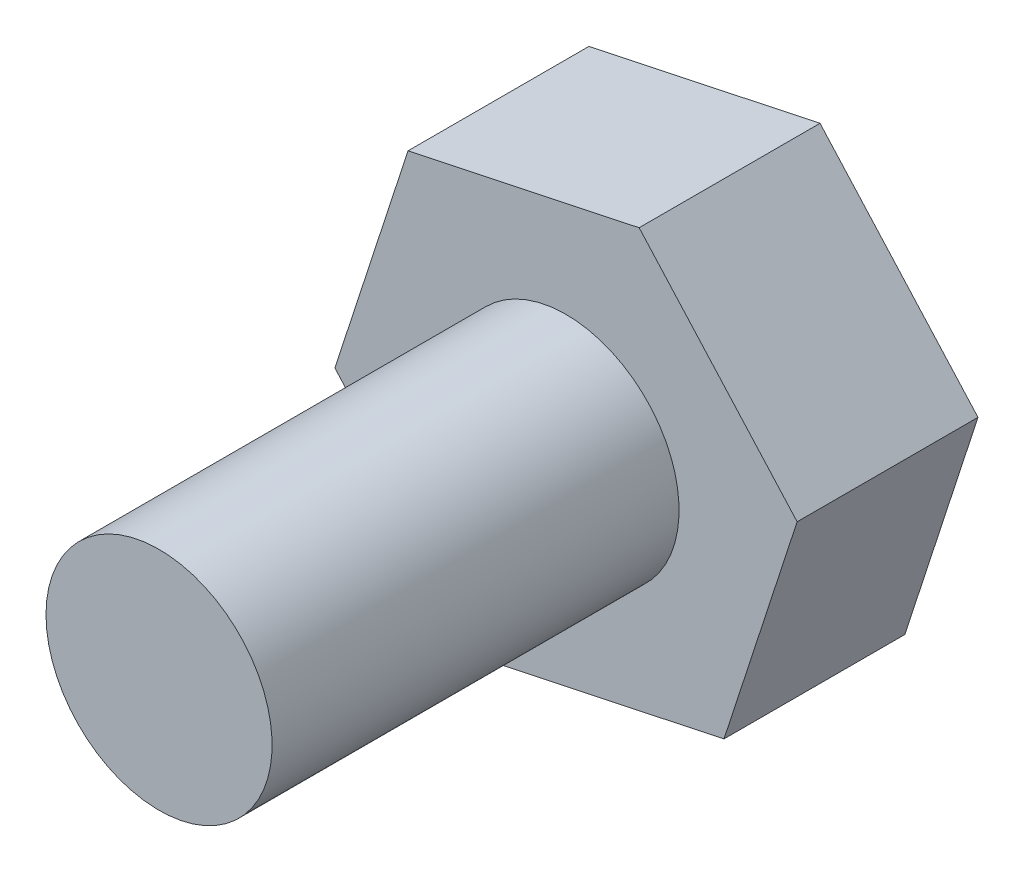
ISO-10303-21;
HEADER;
FILE_DESCRIPTION(('STEP AP214'),'2;1');
FILE_NAME('part.step','',(''),(''),'','','');
FILE_SCHEMA(('AUTOMOTIVE_DESIGN { 1 0 10303 214 1 1 1 1 }'));
ENDSEC;
DATA;
#1=APPLICATION_CONTEXT('core data for automotive mechanical design processes');
#2=APPLICATION_PROTOCOL_DEFINITION('international standard','automotive_design',2000,#1);
#3=PRODUCT_CONTEXT('',#1,'mechanical');
#4=PRODUCT('Part','Part','',(#3));
#5=PRODUCT_RELATED_PRODUCT_CATEGORY('part','',(#4));
#6=PRODUCT_DEFINITION_FORMATION('','',#4);
#7=PRODUCT_DEFINITION_CONTEXT('part definition',#1,'design');
#8=PRODUCT_DEFINITION('design','',#6,#7);
#9=PRODUCT_DEFINITION_SHAPE('','',#8);
#10=(LENGTH_UNIT() NAMED_UNIT(*) SI_UNIT(.MILLI.,.METRE.));
#11=(NAMED_UNIT(*) PLANE_ANGLE_UNIT() SI_UNIT($,.RADIAN.));
#12=(NAMED_UNIT(*) SI_UNIT($,.STERADIAN.) SOLID_ANGLE_UNIT());
#13=UNCERTAINTY_MEASURE_WITH_UNIT(LENGTH_MEASURE(1.E-05),#10,'distance_accuracy_value','');
#14=(GEOMETRIC_REPRESENTATION_CONTEXT(3) GLOBAL_UNCERTAINTY_ASSIGNED_CONTEXT((#13)) GLOBAL_UNIT_ASSIGNED_CONTEXT((#10,
#11,#12)) REPRESENTATION_CONTEXT('',''));
#15=CARTESIAN_POINT('',(0.,0.,0.));
#16=DIRECTION('',(0.,0.,1.));
#17=DIRECTION('',(1.,0.,0.));
#18=AXIS2_PLACEMENT_3D('',#15,#16,#17);
#19=CARTESIAN_POINT('',(0.,0.,4.));
#20=DIRECTION('',(0.,0.,1.));
#21=DIRECTION('',(1.,0.,0.));
#22=AXIS2_PLACEMENT_3D('',#19,#20,#21);
#23=PLANE('',#22);
#24=DIRECTION('',(0.978275614594278,0.207308518614617,0.));
#25=VECTOR('',#24,1.);
#26=CARTESIAN_POINT('',(-1.61769923160188,-4.9683402814418,4.));
#27=LINE('',#26,#25);
#28=CARTESIAN_POINT('',(-1.61769923160188,-4.9683402814418,4.));
#29=VERTEX_POINT('',#28);
#30=CARTESIAN_POINT('',(3.49385928257318,-3.8851387709707,4.));
#31=VERTEX_POINT('',#30);
#32=EDGE_CURVE('E129',#29,#31,#27,.T.);
#33=ORIENTED_EDGE('',*,*,#32,.T.);
#34=DIRECTION('',(0.309603363755961,0.950865793448789,0.));
#35=VECTOR('',#34,1.);
#36=CARTESIAN_POINT('',(3.49385928257318,-3.8851387709707,4.));
#37=LINE('',#36,#35);
#38=CARTESIAN_POINT('',(5.11155851417507,1.0832015104711,4.));
#39=VERTEX_POINT('',#38);
#40=EDGE_CURVE('E87',#31,#39,#37,.T.);
#41=ORIENTED_EDGE('',*,*,#40,.T.);
#42=DIRECTION('',(-0.668672250838317,0.743557274834171,0.));
#43=VECTOR('',#42,1.);
#44=CARTESIAN_POINT('',(5.11155851417507,1.0832015104711,4.));
#45=LINE('',#44,#43);
#46=CARTESIAN_POINT('',(1.61769923160188,4.9683402814418,4.));
#47=VERTEX_POINT('',#46);
#48=EDGE_CURVE('E100',#39,#47,#45,.T.);
#49=ORIENTED_EDGE('',*,*,#48,.T.);
#50=DIRECTION('',(-0.978275614594278,-0.207308518614617,0.));
#51=VECTOR('',#50,1.);
#52=CARTESIAN_POINT('',(1.61769923160188,4.9683402814418,4.));
#53=LINE('',#52,#51);
#54=CARTESIAN_POINT('',(-3.49385928257318,3.8851387709707,4.));
#55=VERTEX_POINT('',#54);
#56=EDGE_CURVE('E94',#47,#55,#53,.T.);
#57=ORIENTED_EDGE('',*,*,#56,.T.);
#58=DIRECTION('',(-0.309603363755961,-0.950865793448789,0.));
#59=VECTOR('',#58,1.);
#60=CARTESIAN_POINT('',(-3.49385928257318,3.8851387709707,4.));
#61=LINE('',#60,#59);
#62=CARTESIAN_POINT('',(-5.11155851417507,-1.0832015104711,4.));
#63=VERTEX_POINT('',#62);
#64=EDGE_CURVE('E98',#55,#63,#61,.T.);
#65=ORIENTED_EDGE('',*,*,#64,.T.);
#66=DIRECTION('',(0.668672250838317,-0.743557274834171,0.));
#67=VECTOR('',#66,1.);
#68=CARTESIAN_POINT('',(-5.11155851417507,-1.0832015104711,4.));
#69=LINE('',#68,#67);
#70=EDGE_CURVE('E50',#63,#29,#69,.T.);
#71=ORIENTED_EDGE('',*,*,#70,.T.);
#72=EDGE_LOOP('',(#33,#41,#49,#57,#65,#71));
#73=FACE_BOUND('',#72,.T.);
#74=CARTESIAN_POINT('',(0.,0.,4.));
#75=DIRECTION('',(0.,0.,1.));
#76=DIRECTION('',(1.,0.,0.));
#77=AXIS2_PLACEMENT_3D('',#74,#75,#76);
#78=CIRCLE('',#77,2.5);
#79=CARTESIAN_POINT('',(-2.5,0.,4.));
#80=VERTEX_POINT('',#79);
#81=EDGE_CURVE('E122',#80,#80,#78,.T.);
#82=ORIENTED_EDGE('',*,*,#81,.F.);
#83=EDGE_LOOP('',(#82));
#84=FACE_BOUND('',#83,.T.);
#85=ADVANCED_FACE('F33',(#73,#84),#23,.T.);
#86=CARTESIAN_POINT('',(0.,0.,0.));
#87=DIRECTION('',(0.,0.,1.));
#88=DIRECTION('',(1.,0.,0.));
#89=AXIS2_PLACEMENT_3D('',#86,#87,#88);
#90=PLANE('',#89);
#91=DIRECTION('',(0.978275614594278,0.207308518614617,0.));
#92=VECTOR('',#91,1.);
#93=CARTESIAN_POINT('',(-1.61769923160188,-4.9683402814418,0.));
#94=LINE('',#93,#92);
#95=CARTESIAN_POINT('',(-1.61769923160188,-4.9683402814418,0.));
#96=VERTEX_POINT('',#95);
#97=CARTESIAN_POINT('',(3.49385928257318,-3.8851387709707,0.));
#98=VERTEX_POINT('',#97);
#99=EDGE_CURVE('E118',#96,#98,#94,.T.);
#100=ORIENTED_EDGE('',*,*,#99,.F.);
#101=DIRECTION('',(0.668672250838317,-0.743557274834171,0.));
#102=VECTOR('',#101,1.);
#103=CARTESIAN_POINT('',(-5.11155851417507,-1.0832015104711,0.));
#104=LINE('',#103,#102);
#105=CARTESIAN_POINT('',(-5.11155851417507,-1.0832015104711,0.));
#106=VERTEX_POINT('',#105);
#107=EDGE_CURVE('E79',#106,#96,#104,.T.);
#108=ORIENTED_EDGE('',*,*,#107,.F.);
#109=DIRECTION('',(-0.309603363755961,-0.950865793448789,0.));
#110=VECTOR('',#109,1.);
#111=CARTESIAN_POINT('',(-3.49385928257318,3.8851387709707,0.));
#112=LINE('',#111,#110);
#113=CARTESIAN_POINT('',(-3.49385928257318,3.8851387709707,0.));
#114=VERTEX_POINT('',#113);
#115=EDGE_CURVE('E73',#114,#106,#112,.T.);
#116=ORIENTED_EDGE('',*,*,#115,.F.);
#117=DIRECTION('',(-0.978275614594278,-0.207308518614617,0.));
#118=VECTOR('',#117,1.);
#119=CARTESIAN_POINT('',(1.61769923160188,4.9683402814418,0.));
#120=LINE('',#119,#118);
#121=CARTESIAN_POINT('',(1.61769923160188,4.9683402814418,0.));
#122=VERTEX_POINT('',#121);
#123=EDGE_CURVE('E108',#122,#114,#120,.T.);
#124=ORIENTED_EDGE('',*,*,#123,.F.);
#125=DIRECTION('',(-0.668672250838317,0.743557274834171,0.));
#126=VECTOR('',#125,1.);
#127=CARTESIAN_POINT('',(5.11155851417507,1.0832015104711,0.));
#128=LINE('',#127,#126);
#129=CARTESIAN_POINT('',(5.11155851417507,1.0832015104711,0.));
#130=VERTEX_POINT('',#129);
#131=EDGE_CURVE('E124',#130,#122,#128,.T.);
#132=ORIENTED_EDGE('',*,*,#131,.F.);
#133=DIRECTION('',(0.309603363755961,0.950865793448789,0.));
#134=VECTOR('',#133,1.);
#135=CARTESIAN_POINT('',(3.49385928257318,-3.8851387709707,0.));
#136=LINE('',#135,#134);
#137=EDGE_CURVE('E121',#98,#130,#136,.T.);
#138=ORIENTED_EDGE('',*,*,#137,.F.);
#139=EDGE_LOOP('',(#100,#108,#116,#124,#132,#138));
#140=FACE_BOUND('',#139,.T.);
#141=ADVANCED_FACE('F138',(#140),#90,.F.);
#142=CARTESIAN_POINT('',(-1.61769923160188,-4.9683402814418,4.));
#143=DIRECTION('',(-0.207308518614617,0.978275614594278,0.));
#144=DIRECTION('',(-0.978275614594278,-0.207308518614617,0.));
#145=AXIS2_PLACEMENT_3D('',#142,#143,#144);
#146=PLANE('',#145);
#147=ORIENTED_EDGE('',*,*,#99,.T.);
#148=DIRECTION('',(0.,0.,-1.));
#149=VECTOR('',#148,1.);
#150=CARTESIAN_POINT('',(3.49385928257318,-3.8851387709707,4.));
#151=LINE('',#150,#149);
#152=EDGE_CURVE('E11',#31,#98,#151,.T.);
#153=ORIENTED_EDGE('',*,*,#152,.F.);
#154=ORIENTED_EDGE('',*,*,#32,.F.);
#155=DIRECTION('',(0.,0.,-1.));
#156=VECTOR('',#155,1.);
#157=CARTESIAN_POINT('',(-1.61769923160188,-4.9683402814418,4.));
#158=LINE('',#157,#156);
#159=EDGE_CURVE('E114',#29,#96,#158,.T.);
#160=ORIENTED_EDGE('',*,*,#159,.T.);
#161=EDGE_LOOP('',(#147,#153,#154,#160));
#162=FACE_BOUND('',#161,.T.);
#163=ADVANCED_FACE('F35',(#162),#146,.F.);
#164=CARTESIAN_POINT('',(3.49385928257318,-3.8851387709707,4.));
#165=DIRECTION('',(-0.950865793448789,0.309603363755961,0.));
#166=DIRECTION('',(-0.309603363755961,-0.950865793448789,0.));
#167=AXIS2_PLACEMENT_3D('',#164,#165,#166);
#168=PLANE('',#167);
#169=ORIENTED_EDGE('',*,*,#137,.T.);
#170=DIRECTION('',(0.,0.,-1.));
#171=VECTOR('',#170,1.);
#172=CARTESIAN_POINT('',(5.11155851417507,1.0832015104711,4.));
#173=LINE('',#172,#171);
#174=EDGE_CURVE('E42',#39,#130,#173,.T.);
#175=ORIENTED_EDGE('',*,*,#174,.F.);
#176=ORIENTED_EDGE('',*,*,#40,.F.);
#177=ORIENTED_EDGE('',*,*,#152,.T.);
#178=EDGE_LOOP('',(#169,#175,#176,#177));
#179=FACE_BOUND('',#178,.T.);
#180=ADVANCED_FACE('F214',(#179),#168,.F.);
#181=CARTESIAN_POINT('',(5.11155851417507,1.0832015104711,4.));
#182=DIRECTION('',(-0.743557274834171,-0.668672250838317,0.));
#183=DIRECTION('',(0.668672250838317,-0.743557274834171,0.));
#184=AXIS2_PLACEMENT_3D('',#181,#182,#183);
#185=PLANE('',#184);
#186=ORIENTED_EDGE('',*,*,#131,.T.);
#187=DIRECTION('',(0.,0.,-1.));
#188=VECTOR('',#187,1.);
#189=CARTESIAN_POINT('',(1.61769923160188,4.9683402814418,4.));
#190=LINE('',#189,#188);
#191=EDGE_CURVE('E109',#47,#122,#190,.T.);
#192=ORIENTED_EDGE('',*,*,#191,.F.);
#193=ORIENTED_EDGE('',*,*,#48,.F.);
#194=ORIENTED_EDGE('',*,*,#174,.T.);
#195=EDGE_LOOP('',(#186,#192,#193,#194));
#196=FACE_BOUND('',#195,.T.);
#197=ADVANCED_FACE('F135',(#196),#185,.F.);
#198=CARTESIAN_POINT('',(1.61769923160188,4.9683402814418,4.));
#199=DIRECTION('',(0.207308518614617,-0.978275614594278,0.));
#200=DIRECTION('',(0.978275614594278,0.207308518614617,0.));
#201=AXIS2_PLACEMENT_3D('',#198,#199,#200);
#202=PLANE('',#201);
#203=ORIENTED_EDGE('',*,*,#123,.T.);
#204=DIRECTION('',(0.,0.,-1.));
#205=VECTOR('',#204,1.);
#206=CARTESIAN_POINT('',(-3.49385928257318,3.8851387709707,4.));
#207=LINE('',#206,#205);
#208=EDGE_CURVE('E105',#55,#114,#207,.T.);
#209=ORIENTED_EDGE('',*,*,#208,.F.);
#210=ORIENTED_EDGE('',*,*,#56,.F.);
#211=ORIENTED_EDGE('',*,*,#191,.T.);
#212=EDGE_LOOP('',(#203,#209,#210,#211));
#213=FACE_BOUND('',#212,.T.);
#214=ADVANCED_FACE('F106',(#213),#202,.F.);
#215=CARTESIAN_POINT('',(-3.49385928257318,3.8851387709707,4.));
#216=DIRECTION('',(0.950865793448789,-0.309603363755961,0.));
#217=DIRECTION('',(0.309603363755961,0.950865793448789,0.));
#218=AXIS2_PLACEMENT_3D('',#215,#216,#217);
#219=PLANE('',#218);
#220=ORIENTED_EDGE('',*,*,#115,.T.);
#221=DIRECTION('',(0.,0.,-1.));
#222=VECTOR('',#221,1.);
#223=CARTESIAN_POINT('',(-5.11155851417507,-1.0832015104711,4.));
#224=LINE('',#223,#222);
#225=EDGE_CURVE('E110',#63,#106,#224,.T.);
#226=ORIENTED_EDGE('',*,*,#225,.F.);
#227=ORIENTED_EDGE('',*,*,#64,.F.);
#228=ORIENTED_EDGE('',*,*,#208,.T.);
#229=EDGE_LOOP('',(#220,#226,#227,#228));
#230=FACE_BOUND('',#229,.T.);
#231=ADVANCED_FACE('F112',(#230),#219,.F.);
#232=CARTESIAN_POINT('',(-5.11155851417507,-1.0832015104711,4.));
#233=DIRECTION('',(0.743557274834171,0.668672250838317,0.));
#234=DIRECTION('',(-0.668672250838317,0.743557274834171,0.));
#235=AXIS2_PLACEMENT_3D('',#232,#233,#234);
#236=PLANE('',#235);
#237=ORIENTED_EDGE('',*,*,#107,.T.);
#238=ORIENTED_EDGE('',*,*,#159,.F.);
#239=ORIENTED_EDGE('',*,*,#70,.F.);
#240=ORIENTED_EDGE('',*,*,#225,.T.);
#241=EDGE_LOOP('',(#237,#238,#239,#240));
#242=FACE_BOUND('',#241,.T.);
#243=ADVANCED_FACE('F142',(#242),#236,.F.);
#244=CARTESIAN_POINT('',(0.,0.,13.));
#245=DIRECTION('',(0.,0.,-1.));
#246=DIRECTION('',(-1.,0.,0.));
#247=AXIS2_PLACEMENT_3D('',#244,#245,#246);
#248=CYLINDRICAL_SURFACE('',#247,2.5);
#249=CARTESIAN_POINT('',(0.,0.,13.));
#250=DIRECTION('',(0.,0.,-1.));
#251=DIRECTION('',(-1.,0.,0.));
#252=AXIS2_PLACEMENT_3D('',#249,#250,#251);
#253=CIRCLE('',#252,2.5);
#254=CARTESIAN_POINT('',(-2.5,0.,13.));
#255=VERTEX_POINT('',#254);
#256=EDGE_CURVE('E167',#255,#255,#253,.T.);
#257=CARTESIAN_POINT('',(-2.5,0.,4.));
#258=CARTESIAN_POINT('',(-2.5,0.,4.09375));
#259=CARTESIAN_POINT('',(-2.5,0.,4.1875));
#260=CARTESIAN_POINT('',(-2.5,0.,4.375));
#261=CARTESIAN_POINT('',(-2.5,0.,4.46875));
#262=CARTESIAN_POINT('',(-2.5,0.,4.65625));
#263=CARTESIAN_POINT('',(-2.5,0.,4.75));
#264=CARTESIAN_POINT('',(-2.5,0.,4.9375));
#265=CARTESIAN_POINT('',(-2.5,0.,5.03125));
#266=CARTESIAN_POINT('',(-2.5,0.,5.21875));
#267=CARTESIAN_POINT('',(-2.5,0.,5.3125));
#268=CARTESIAN_POINT('',(-2.5,0.,5.5));
#269=CARTESIAN_POINT('',(-2.5,0.,5.59375));
#270=CARTESIAN_POINT('',(-2.5,0.,5.78125));
#271=CARTESIAN_POINT('',(-2.5,0.,5.875));
#272=CARTESIAN_POINT('',(-2.5,0.,6.0625));
#273=CARTESIAN_POINT('',(-2.5,0.,6.15625));
#274=CARTESIAN_POINT('',(-2.5,0.,6.34375));
#275=CARTESIAN_POINT('',(-2.5,0.,6.4375));
#276=CARTESIAN_POINT('',(-2.5,0.,6.625));
#277=CARTESIAN_POINT('',(-2.5,0.,6.71875));
#278=CARTESIAN_POINT('',(-2.5,0.,6.90625));
#279=CARTESIAN_POINT('',(-2.5,0.,7.));
#280=CARTESIAN_POINT('',(-2.5,0.,7.1875));
#281=CARTESIAN_POINT('',(-2.5,0.,7.28125));
#282=CARTESIAN_POINT('',(-2.5,0.,7.46875));
#283=CARTESIAN_POINT('',(-2.5,0.,7.5625));
#284=CARTESIAN_POINT('',(-2.5,0.,7.75));
#285=CARTESIAN_POINT('',(-2.5,0.,7.84375));
#286=CARTESIAN_POINT('',(-2.5,0.,8.03125));
#287=CARTESIAN_POINT('',(-2.5,0.,8.125));
#288=CARTESIAN_POINT('',(-2.5,0.,8.3125));
#289=CARTESIAN_POINT('',(-2.5,0.,8.40625));
#290=CARTESIAN_POINT('',(-2.5,0.,8.59375));
#291=CARTESIAN_POINT('',(-2.5,0.,8.6875));
#292=CARTESIAN_POINT('',(-2.5,0.,8.875));
#293=CARTESIAN_POINT('',(-2.5,0.,8.96875));
#294=CARTESIAN_POINT('',(-2.5,0.,9.15625));
#295=CARTESIAN_POINT('',(-2.5,0.,9.25));
#296=CARTESIAN_POINT('',(-2.5,0.,9.4375));
#297=CARTESIAN_POINT('',(-2.5,0.,9.53125));
#298=CARTESIAN_POINT('',(-2.5,0.,9.71875));
#299=CARTESIAN_POINT('',(-2.5,0.,9.8125));
#300=CARTESIAN_POINT('',(-2.5,0.,10.));
#301=CARTESIAN_POINT('',(-2.5,0.,10.09375));
#302=CARTESIAN_POINT('',(-2.5,0.,10.28125));
#303=CARTESIAN_POINT('',(-2.5,0.,10.375));
#304=CARTESIAN_POINT('',(-2.5,0.,10.5625));
#305=CARTESIAN_POINT('',(-2.5,0.,10.65625));
#306=CARTESIAN_POINT('',(-2.5,0.,10.84375));
#307=CARTESIAN_POINT('',(-2.5,0.,10.9375));
#308=CARTESIAN_POINT('',(-2.5,0.,11.125));
#309=CARTESIAN_POINT('',(-2.5,0.,11.21875));
#310=CARTESIAN_POINT('',(-2.5,0.,11.40625));
#311=CARTESIAN_POINT('',(-2.5,0.,11.5));
#312=CARTESIAN_POINT('',(-2.5,0.,11.6875));
#313=CARTESIAN_POINT('',(-2.5,0.,11.78125));
#314=CARTESIAN_POINT('',(-2.5,0.,11.96875));
#315=CARTESIAN_POINT('',(-2.5,0.,12.0625));
#316=CARTESIAN_POINT('',(-2.5,0.,12.25));
#317=CARTESIAN_POINT('',(-2.5,0.,12.34375));
#318=CARTESIAN_POINT('',(-2.5,0.,12.53125));
#319=CARTESIAN_POINT('',(-2.5,0.,12.625));
#320=CARTESIAN_POINT('',(-2.5,0.,12.8125));
#321=CARTESIAN_POINT('',(-2.5,0.,12.90625));
#322=CARTESIAN_POINT('',(-2.5,0.,13.));
#323=B_SPLINE_CURVE_WITH_KNOTS('',3,(#257,#258,#259,#260,#261,#262,#263,#264,#265,#266,#267,
#268,#269,#270,#271,#272,#273,#274,#275,#276,#277,#278,#279,#280,#281,#282,#283,#284,#285,#286,
#287,#288,#289,#290,#291,#292,#293,#294,#295,#296,#297,#298,#299,#300,#301,#302,#303,#304,#305,
#306,#307,#308,#309,#310,#311,#312,#313,#314,#315,#316,#317,#318,#319,#320,#321,#322),
.UNSPECIFIED.,.F.,.F.,(4,2,2,2,2,2,2,2,2,2,2,2,2,2,2,2,2,2,2,2,2,2,2,2,2,2,2,2,2,2,2,2,4),(0.,
0.28125,0.5625,0.843750000000001,1.125,1.40625,1.6875,1.96875,2.25,2.53125,2.8125,3.09375,3.375,
3.65625,3.9375,4.21875,4.5,4.78125,5.0625,5.34375,5.625,5.90625,6.1875,6.46875,6.75,7.03125,
7.3125,7.59375,7.875,8.15625,8.4375,8.71875,9.),.UNSPECIFIED.);
#324=EDGE_CURVE('BSEAM144',#80,#255,#323,.T.);
#325=ORIENTED_EDGE('',*,*,#81,.T.);
#326=ORIENTED_EDGE('',*,*,#256,.T.);
#327=ORIENTED_EDGE('',*,*,#324,.T.);
#328=ORIENTED_EDGE('',*,*,#324,.F.);
#329=EDGE_LOOP('',(#325,#327,#326,#328));
#330=FACE_BOUND('',#329,.T.);
#331=ADVANCED_FACE('F144',(#330),#248,.T.);
#332=CARTESIAN_POINT('',(0.,0.,13.));
#333=DIRECTION('',(0.,0.,-1.));
#334=DIRECTION('',(-1.,0.,0.));
#335=AXIS2_PLACEMENT_3D('',#332,#333,#334);
#336=PLANE('',#335);
#337=ORIENTED_EDGE('',*,*,#256,.F.);
#338=EDGE_LOOP('',(#337));
#339=FACE_BOUND('',#338,.T.);
#340=ADVANCED_FACE('F150',(#339),#336,.F.);
#341=CLOSED_SHELL('',(#85,#141,#163,#180,#197,#214,#231,#243,#331,#340));
#342=MANIFOLD_SOLID_BREP('B2',#341);
#343=ADVANCED_BREP_SHAPE_REPRESENTATION('',(#18,#342),#14);
#344=SHAPE_DEFINITION_REPRESENTATION(#9,#343);
ENDSEC;
END-ISO-10303-21;
